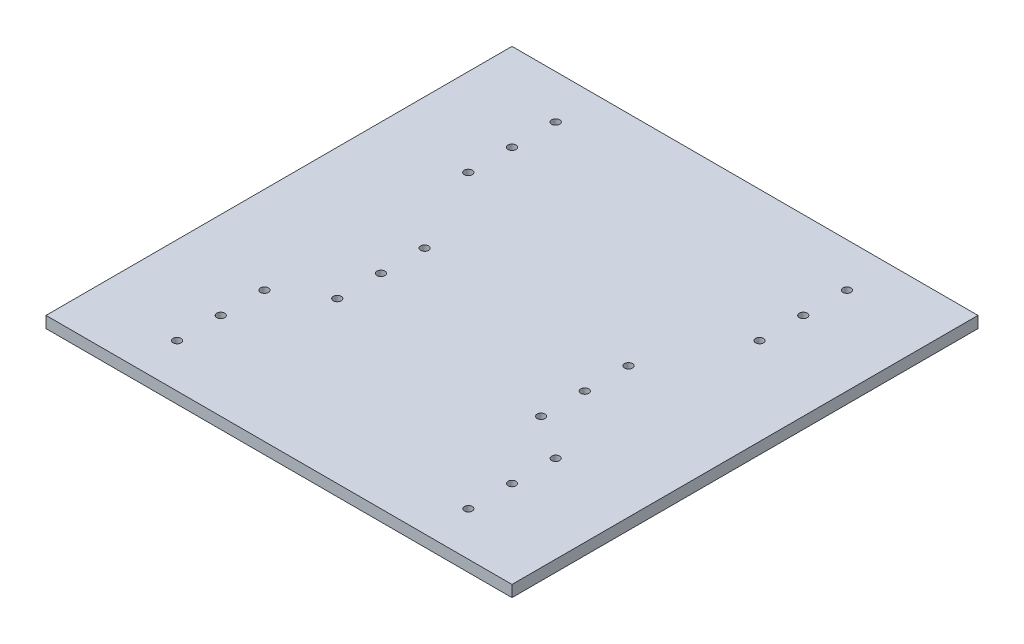
ISO-10303-21;
HEADER;
FILE_DESCRIPTION(('STEP AP214'),'2;1');
FILE_NAME('part.step','',(''),(''),'','','');
FILE_SCHEMA(('AUTOMOTIVE_DESIGN { 1 0 10303 214 1 1 1 1 }'));
ENDSEC;
DATA;
#1=APPLICATION_CONTEXT('core data for automotive mechanical design processes');
#2=APPLICATION_PROTOCOL_DEFINITION('international standard','automotive_design',2000,#1);
#3=PRODUCT_CONTEXT('',#1,'mechanical');
#4=PRODUCT('Part','Part','',(#3));
#5=PRODUCT_RELATED_PRODUCT_CATEGORY('part','',(#4));
#6=PRODUCT_DEFINITION_FORMATION('','',#4);
#7=PRODUCT_DEFINITION_CONTEXT('part definition',#1,'design');
#8=PRODUCT_DEFINITION('design','',#6,#7);
#9=PRODUCT_DEFINITION_SHAPE('','',#8);
#10=(LENGTH_UNIT() NAMED_UNIT(*) SI_UNIT(.MILLI.,.METRE.));
#11=(NAMED_UNIT(*) PLANE_ANGLE_UNIT() SI_UNIT($,.RADIAN.));
#12=(NAMED_UNIT(*) SI_UNIT($,.STERADIAN.) SOLID_ANGLE_UNIT());
#13=UNCERTAINTY_MEASURE_WITH_UNIT(LENGTH_MEASURE(1.E-05),#10,'distance_accuracy_value','');
#14=(GEOMETRIC_REPRESENTATION_CONTEXT(3) GLOBAL_UNCERTAINTY_ASSIGNED_CONTEXT((#13)) GLOBAL_UNIT_ASSIGNED_CONTEXT((#10,
#11,#12)) REPRESENTATION_CONTEXT('',''));
#15=CARTESIAN_POINT('',(0.,0.,0.));
#16=DIRECTION('',(0.,0.,1.));
#17=DIRECTION('',(1.,0.,0.));
#18=AXIS2_PLACEMENT_3D('',#15,#16,#17);
#19=CARTESIAN_POINT('',(0.,4.99999,0.));
#20=DIRECTION('',(0.,-1.,0.));
#21=DIRECTION('',(0.,0.,-1.));
#22=AXIS2_PLACEMENT_3D('',#19,#20,#21);
#23=PLANE('',#22);
#24=CARTESIAN_POINT('',(-44.45,4.99999,12.7));
#25=DIRECTION('',(0.,1.,0.));
#26=DIRECTION('',(0.,0.,1.));
#27=AXIS2_PLACEMENT_3D('',#24,#25,#26);
#28=CIRCLE('',#27,1.72719999999998);
#29=CARTESIAN_POINT('',(-44.45,4.99999,14.4272));
#30=VERTEX_POINT('',#29);
#31=EDGE_CURVE('E212',#30,#30,#28,.T.);
#32=ORIENTED_EDGE('',*,*,#31,.F.);
#33=EDGE_LOOP('',(#32));
#34=FACE_BOUND('',#33,.T.);
#35=CARTESIAN_POINT('',(44.45,4.99999,31.75));
#36=DIRECTION('',(0.,1.,0.));
#37=DIRECTION('',(0.,0.,1.));
#38=AXIS2_PLACEMENT_3D('',#35,#36,#37);
#39=CIRCLE('',#38,1.72719999999999);
#40=CARTESIAN_POINT('',(44.45,4.99999,33.4771999999999));
#41=VERTEX_POINT('',#40);
#42=EDGE_CURVE('E200',#41,#41,#39,.T.);
#43=ORIENTED_EDGE('',*,*,#42,.F.);
#44=EDGE_LOOP('',(#43));
#45=FACE_BOUND('',#44,.T.);
#46=CARTESIAN_POINT('',(44.45,4.99999,-6.35000000000004));
#47=DIRECTION('',(0.,1.,0.));
#48=DIRECTION('',(0.,0.,1.));
#49=AXIS2_PLACEMENT_3D('',#46,#47,#48);
#50=CIRCLE('',#49,1.72719999999999);
#51=CARTESIAN_POINT('',(44.45,4.99999,-4.62280000000005));
#52=VERTEX_POINT('',#51);
#53=EDGE_CURVE('E188',#52,#52,#50,.T.);
#54=ORIENTED_EDGE('',*,*,#53,.F.);
#55=EDGE_LOOP('',(#54));
#56=FACE_BOUND('',#55,.T.);
#57=CARTESIAN_POINT('',(-63.5,4.99999,63.5));
#58=DIRECTION('',(0.,1.,0.));
#59=DIRECTION('',(0.,0.,1.));
#60=AXIS2_PLACEMENT_3D('',#57,#58,#59);
#61=CIRCLE('',#60,1.72719999999998);
#62=CARTESIAN_POINT('',(-63.5,4.99999,65.2272));
#63=VERTEX_POINT('',#62);
#64=EDGE_CURVE('E176',#63,#63,#61,.T.);
#65=ORIENTED_EDGE('',*,*,#64,.F.);
#66=EDGE_LOOP('',(#65));
#67=FACE_BOUND('',#66,.T.);
#68=CARTESIAN_POINT('',(63.4999999999999,4.99999,44.45));
#69=DIRECTION('',(0.,1.,0.));
#70=DIRECTION('',(0.,0.,1.));
#71=AXIS2_PLACEMENT_3D('',#68,#69,#70);
#72=CIRCLE('',#71,1.72719999999998);
#73=CARTESIAN_POINT('',(63.4999999999999,4.99999,46.1772));
#74=VERTEX_POINT('',#73);
#75=EDGE_CURVE('E164',#74,#74,#72,.T.);
#76=ORIENTED_EDGE('',*,*,#75,.F.);
#77=EDGE_LOOP('',(#76));
#78=FACE_BOUND('',#77,.T.);
#79=CARTESIAN_POINT('',(63.4999999999999,4.99999,82.55));
#80=DIRECTION('',(0.,1.,0.));
#81=DIRECTION('',(0.,0.,1.));
#82=AXIS2_PLACEMENT_3D('',#79,#80,#81);
#83=CIRCLE('',#82,1.72719999999998);
#84=CARTESIAN_POINT('',(63.4999999999999,4.99999,84.2772));
#85=VERTEX_POINT('',#84);
#86=EDGE_CURVE('E158',#85,#85,#83,.T.);
#87=ORIENTED_EDGE('',*,*,#86,.F.);
#88=EDGE_LOOP('',(#87));
#89=FACE_BOUND('',#88,.T.);
#90=DIRECTION('',(0.,0.,-1.));
#91=VECTOR('',#90,1.);
#92=CARTESIAN_POINT('',(101.6,4.99999,101.6));
#93=LINE('',#92,#91);
#94=CARTESIAN_POINT('',(101.6,4.99999,101.6));
#95=VERTEX_POINT('',#94);
#96=CARTESIAN_POINT('',(101.6,4.99999,-101.6));
#97=VERTEX_POINT('',#96);
#98=EDGE_CURVE('E88',#95,#97,#93,.T.);
#99=ORIENTED_EDGE('',*,*,#98,.T.);
#100=DIRECTION('',(-1.,0.,0.));
#101=VECTOR('',#100,1.);
#102=CARTESIAN_POINT('',(-101.6,4.99999,-101.6));
#103=LINE('',#102,#101);
#104=CARTESIAN_POINT('',(-101.6,4.99999,-101.6));
#105=VERTEX_POINT('',#104);
#106=EDGE_CURVE('E83',#97,#105,#103,.T.);
#107=ORIENTED_EDGE('',*,*,#106,.T.);
#108=DIRECTION('',(0.,0.,1.));
#109=VECTOR('',#108,1.);
#110=CARTESIAN_POINT('',(-101.6,4.99999,101.6));
#111=LINE('',#110,#109);
#112=CARTESIAN_POINT('',(-101.6,4.99999,101.6));
#113=VERTEX_POINT('',#112);
#114=EDGE_CURVE('E86',#105,#113,#111,.T.);
#115=ORIENTED_EDGE('',*,*,#114,.T.);
#116=DIRECTION('',(1.,0.,0.));
#117=VECTOR('',#116,1.);
#118=CARTESIAN_POINT('',(-101.6,4.99999,101.6));
#119=LINE('',#118,#117);
#120=EDGE_CURVE('E53',#113,#95,#119,.T.);
#121=ORIENTED_EDGE('',*,*,#120,.T.);
#122=EDGE_LOOP('',(#99,#107,#115,#121));
#123=FACE_BOUND('',#122,.T.);
#124=CARTESIAN_POINT('',(-63.5,4.99999,-82.55));
#125=DIRECTION('',(0.,1.,0.));
#126=DIRECTION('',(0.,0.,1.));
#127=AXIS2_PLACEMENT_3D('',#124,#125,#126);
#128=CIRCLE('',#127,1.72719999999998);
#129=CARTESIAN_POINT('',(-63.5,4.99999,-80.8228));
#130=VERTEX_POINT('',#129);
#131=EDGE_CURVE('E116',#130,#130,#128,.T.);
#132=ORIENTED_EDGE('',*,*,#131,.F.);
#133=EDGE_LOOP('',(#132));
#134=FACE_BOUND('',#133,.T.);
#135=CARTESIAN_POINT('',(-63.5,4.99999,-63.5));
#136=DIRECTION('',(0.,1.,0.));
#137=DIRECTION('',(0.,0.,1.));
#138=AXIS2_PLACEMENT_3D('',#135,#136,#137);
#139=CIRCLE('',#138,1.72719999999998);
#140=CARTESIAN_POINT('',(-63.5,4.99999,-61.7728));
#141=VERTEX_POINT('',#140);
#142=EDGE_CURVE('E122',#141,#141,#139,.T.);
#143=ORIENTED_EDGE('',*,*,#142,.F.);
#144=EDGE_LOOP('',(#143));
#145=FACE_BOUND('',#144,.T.);
#146=CARTESIAN_POINT('',(-63.5,4.99999,-44.45));
#147=DIRECTION('',(0.,1.,0.));
#148=DIRECTION('',(0.,0.,1.));
#149=AXIS2_PLACEMENT_3D('',#146,#147,#148);
#150=CIRCLE('',#149,1.72719999999998);
#151=CARTESIAN_POINT('',(-63.5,4.99999,-42.7228));
#152=VERTEX_POINT('',#151);
#153=EDGE_CURVE('E128',#152,#152,#150,.T.);
#154=ORIENTED_EDGE('',*,*,#153,.F.);
#155=EDGE_LOOP('',(#154));
#156=FACE_BOUND('',#155,.T.);
#157=CARTESIAN_POINT('',(63.5,4.99999,-44.45));
#158=DIRECTION('',(0.,1.,0.));
#159=DIRECTION('',(0.,0.,1.));
#160=AXIS2_PLACEMENT_3D('',#157,#158,#159);
#161=CIRCLE('',#160,1.72719999999998);
#162=CARTESIAN_POINT('',(63.5,4.99999,-42.7228));
#163=VERTEX_POINT('',#162);
#164=EDGE_CURVE('E134',#163,#163,#161,.T.);
#165=ORIENTED_EDGE('',*,*,#164,.F.);
#166=EDGE_LOOP('',(#165));
#167=FACE_BOUND('',#166,.T.);
#168=CARTESIAN_POINT('',(63.5,4.99999,-63.5));
#169=DIRECTION('',(0.,1.,0.));
#170=DIRECTION('',(0.,0.,1.));
#171=AXIS2_PLACEMENT_3D('',#168,#169,#170);
#172=CIRCLE('',#171,1.72719999999998);
#173=CARTESIAN_POINT('',(63.5,4.99999,-61.7728));
#174=VERTEX_POINT('',#173);
#175=EDGE_CURVE('E140',#174,#174,#172,.T.);
#176=ORIENTED_EDGE('',*,*,#175,.F.);
#177=EDGE_LOOP('',(#176));
#178=FACE_BOUND('',#177,.T.);
#179=CARTESIAN_POINT('',(63.5,4.99999,-82.55));
#180=DIRECTION('',(0.,1.,0.));
#181=DIRECTION('',(0.,0.,1.));
#182=AXIS2_PLACEMENT_3D('',#179,#180,#181);
#183=CIRCLE('',#182,1.72719999999998);
#184=CARTESIAN_POINT('',(63.5,4.99999,-80.8228));
#185=VERTEX_POINT('',#184);
#186=EDGE_CURVE('E146',#185,#185,#183,.T.);
#187=ORIENTED_EDGE('',*,*,#186,.F.);
#188=EDGE_LOOP('',(#187));
#189=FACE_BOUND('',#188,.T.);
#190=CARTESIAN_POINT('',(63.4999999999999,4.99999,63.5));
#191=DIRECTION('',(0.,1.,0.));
#192=DIRECTION('',(0.,0.,1.));
#193=AXIS2_PLACEMENT_3D('',#190,#191,#192);
#194=CIRCLE('',#193,1.72719999999998);
#195=CARTESIAN_POINT('',(63.4999999999999,4.99999,65.2272));
#196=VERTEX_POINT('',#195);
#197=EDGE_CURVE('E152',#196,#196,#194,.T.);
#198=ORIENTED_EDGE('',*,*,#197,.F.);
#199=EDGE_LOOP('',(#198));
#200=FACE_BOUND('',#199,.T.);
#201=CARTESIAN_POINT('',(-63.5,4.99999,82.55));
#202=DIRECTION('',(0.,1.,0.));
#203=DIRECTION('',(0.,0.,1.));
#204=AXIS2_PLACEMENT_3D('',#201,#202,#203);
#205=CIRCLE('',#204,1.72719999999998);
#206=CARTESIAN_POINT('',(-63.5,4.99999,84.2772));
#207=VERTEX_POINT('',#206);
#208=EDGE_CURVE('E170',#207,#207,#205,.T.);
#209=ORIENTED_EDGE('',*,*,#208,.F.);
#210=EDGE_LOOP('',(#209));
#211=FACE_BOUND('',#210,.T.);
#212=CARTESIAN_POINT('',(-63.5,4.99999,44.45));
#213=DIRECTION('',(0.,1.,0.));
#214=DIRECTION('',(0.,0.,1.));
#215=AXIS2_PLACEMENT_3D('',#212,#213,#214);
#216=CIRCLE('',#215,1.72719999999998);
#217=CARTESIAN_POINT('',(-63.5,4.99999,46.1772));
#218=VERTEX_POINT('',#217);
#219=EDGE_CURVE('E182',#218,#218,#216,.T.);
#220=ORIENTED_EDGE('',*,*,#219,.F.);
#221=EDGE_LOOP('',(#220));
#222=FACE_BOUND('',#221,.T.);
#223=CARTESIAN_POINT('',(44.45,4.99999,12.7));
#224=DIRECTION('',(0.,1.,0.));
#225=DIRECTION('',(0.,0.,1.));
#226=AXIS2_PLACEMENT_3D('',#223,#224,#225);
#227=CIRCLE('',#226,1.72719999999999);
#228=CARTESIAN_POINT('',(44.45,4.99999,14.4271999999999));
#229=VERTEX_POINT('',#228);
#230=EDGE_CURVE('E194',#229,#229,#227,.T.);
#231=ORIENTED_EDGE('',*,*,#230,.F.);
#232=EDGE_LOOP('',(#231));
#233=FACE_BOUND('',#232,.T.);
#234=CARTESIAN_POINT('',(-44.45,4.99999,31.75));
#235=DIRECTION('',(0.,1.,0.));
#236=DIRECTION('',(0.,0.,1.));
#237=AXIS2_PLACEMENT_3D('',#234,#235,#236);
#238=CIRCLE('',#237,1.72719999999998);
#239=CARTESIAN_POINT('',(-44.45,4.99999,33.4771999999999));
#240=VERTEX_POINT('',#239);
#241=EDGE_CURVE('E206',#240,#240,#238,.T.);
#242=ORIENTED_EDGE('',*,*,#241,.F.);
#243=EDGE_LOOP('',(#242));
#244=FACE_BOUND('',#243,.T.);
#245=CARTESIAN_POINT('',(-44.45,4.99999,-6.35000000000004));
#246=DIRECTION('',(0.,1.,0.));
#247=DIRECTION('',(0.,0.,1.));
#248=AXIS2_PLACEMENT_3D('',#245,#246,#247);
#249=CIRCLE('',#248,1.72719999999998);
#250=CARTESIAN_POINT('',(-44.45,4.99999,-4.62280000000005));
#251=VERTEX_POINT('',#250);
#252=EDGE_CURVE('E218',#251,#251,#249,.T.);
#253=ORIENTED_EDGE('',*,*,#252,.F.);
#254=EDGE_LOOP('',(#253));
#255=FACE_BOUND('',#254,.T.);
#256=ADVANCED_FACE('F36',(#34,#45,#56,#67,#78,#89,#123,#134,#145,#156,#167,#178,#189,#200,#211,
#222,#233,#244,#255),#23,.F.);
#257=CARTESIAN_POINT('',(101.6,4.99999,101.6));
#258=DIRECTION('',(-1.,0.,0.));
#259=DIRECTION('',(0.,0.,1.));
#260=AXIS2_PLACEMENT_3D('',#257,#258,#259);
#261=PLANE('',#260);
#262=DIRECTION('',(0.,0.,-1.));
#263=VECTOR('',#262,1.);
#264=CARTESIAN_POINT('',(101.6,0.,101.6));
#265=LINE('',#264,#263);
#266=CARTESIAN_POINT('',(101.6,0.,101.6));
#267=VERTEX_POINT('',#266);
#268=CARTESIAN_POINT('',(101.6,0.,-101.6));
#269=VERTEX_POINT('',#268);
#270=EDGE_CURVE('E100',#267,#269,#265,.T.);
#271=ORIENTED_EDGE('',*,*,#270,.T.);
#272=DIRECTION('',(0.,-1.,0.));
#273=VECTOR('',#272,1.);
#274=CARTESIAN_POINT('',(101.6,4.99999,-101.6));
#275=LINE('',#274,#273);
#276=EDGE_CURVE('E11',#97,#269,#275,.T.);
#277=ORIENTED_EDGE('',*,*,#276,.F.);
#278=ORIENTED_EDGE('',*,*,#98,.F.);
#279=DIRECTION('',(0.,-1.,0.));
#280=VECTOR('',#279,1.);
#281=CARTESIAN_POINT('',(101.6,4.99999,101.6));
#282=LINE('',#281,#280);
#283=EDGE_CURVE('E96',#95,#267,#282,.T.);
#284=ORIENTED_EDGE('',*,*,#283,.T.);
#285=EDGE_LOOP('',(#271,#277,#278,#284));
#286=FACE_BOUND('',#285,.T.);
#287=ADVANCED_FACE('F38',(#286),#261,.F.);
#288=CARTESIAN_POINT('',(-101.6,4.99999,-101.6));
#289=DIRECTION('',(0.,0.,1.));
#290=DIRECTION('',(1.,0.,0.));
#291=AXIS2_PLACEMENT_3D('',#288,#289,#290);
#292=PLANE('',#291);
#293=DIRECTION('',(-1.,0.,0.));
#294=VECTOR('',#293,1.);
#295=CARTESIAN_POINT('',(-101.6,0.,-101.6));
#296=LINE('',#295,#294);
#297=CARTESIAN_POINT('',(-101.6,0.,-101.6));
#298=VERTEX_POINT('',#297);
#299=EDGE_CURVE('E92',#269,#298,#296,.T.);
#300=ORIENTED_EDGE('',*,*,#299,.T.);
#301=DIRECTION('',(0.,-1.,0.));
#302=VECTOR('',#301,1.);
#303=CARTESIAN_POINT('',(-101.6,4.99999,-101.6));
#304=LINE('',#303,#302);
#305=EDGE_CURVE('E45',#105,#298,#304,.T.);
#306=ORIENTED_EDGE('',*,*,#305,.F.);
#307=ORIENTED_EDGE('',*,*,#106,.F.);
#308=ORIENTED_EDGE('',*,*,#276,.T.);
#309=EDGE_LOOP('',(#300,#306,#307,#308));
#310=FACE_BOUND('',#309,.T.);
#311=ADVANCED_FACE('F91',(#310),#292,.F.);
#312=CARTESIAN_POINT('',(-101.6,4.99999,101.6));
#313=DIRECTION('',(1.,0.,0.));
#314=DIRECTION('',(0.,0.,-1.));
#315=AXIS2_PLACEMENT_3D('',#312,#313,#314);
#316=PLANE('',#315);
#317=DIRECTION('',(0.,0.,1.));
#318=VECTOR('',#317,1.);
#319=CARTESIAN_POINT('',(-101.6,0.,101.6));
#320=LINE('',#319,#318);
#321=CARTESIAN_POINT('',(-101.6,0.,101.6));
#322=VERTEX_POINT('',#321);
#323=EDGE_CURVE('E70',#298,#322,#320,.T.);
#324=ORIENTED_EDGE('',*,*,#323,.T.);
#325=DIRECTION('',(0.,-1.,0.));
#326=VECTOR('',#325,1.);
#327=CARTESIAN_POINT('',(-101.6,4.99999,101.6));
#328=LINE('',#327,#326);
#329=EDGE_CURVE('E93',#113,#322,#328,.T.);
#330=ORIENTED_EDGE('',*,*,#329,.F.);
#331=ORIENTED_EDGE('',*,*,#114,.F.);
#332=ORIENTED_EDGE('',*,*,#305,.T.);
#333=EDGE_LOOP('',(#324,#330,#331,#332));
#334=FACE_BOUND('',#333,.T.);
#335=ADVANCED_FACE('F94',(#334),#316,.F.);
#336=CARTESIAN_POINT('',(-101.6,4.99999,101.6));
#337=DIRECTION('',(0.,0.,-1.));
#338=DIRECTION('',(-1.,0.,0.));
#339=AXIS2_PLACEMENT_3D('',#336,#337,#338);
#340=PLANE('',#339);
#341=DIRECTION('',(1.,0.,0.));
#342=VECTOR('',#341,1.);
#343=CARTESIAN_POINT('',(-101.6,0.,101.6));
#344=LINE('',#343,#342);
#345=EDGE_CURVE('E76',#322,#267,#344,.T.);
#346=ORIENTED_EDGE('',*,*,#345,.T.);
#347=ORIENTED_EDGE('',*,*,#283,.F.);
#348=ORIENTED_EDGE('',*,*,#120,.F.);
#349=ORIENTED_EDGE('',*,*,#329,.T.);
#350=EDGE_LOOP('',(#346,#347,#348,#349));
#351=FACE_BOUND('',#350,.T.);
#352=ADVANCED_FACE('F108',(#351),#340,.F.);
#353=CARTESIAN_POINT('',(0.,0.,0.));
#354=DIRECTION('',(0.,-1.,0.));
#355=DIRECTION('',(0.,0.,-1.));
#356=AXIS2_PLACEMENT_3D('',#353,#354,#355);
#357=PLANE('',#356);
#358=CARTESIAN_POINT('',(-44.45,0.,-6.35000000000004));
#359=DIRECTION('',(0.,-1.,0.));
#360=DIRECTION('',(0.,0.,-1.));
#361=AXIS2_PLACEMENT_3D('',#358,#359,#360);
#362=CIRCLE('',#361,1.72719999999999);
#363=CARTESIAN_POINT('',(-44.45,0.,-8.07720000000003));
#364=VERTEX_POINT('',#363);
#365=EDGE_CURVE('E215',#364,#364,#362,.T.);
#366=ORIENTED_EDGE('',*,*,#365,.F.);
#367=EDGE_LOOP('',(#366));
#368=FACE_BOUND('',#367,.T.);
#369=CARTESIAN_POINT('',(-44.45,0.,12.7));
#370=DIRECTION('',(0.,-1.,0.));
#371=DIRECTION('',(0.,0.,-1.));
#372=AXIS2_PLACEMENT_3D('',#369,#370,#371);
#373=CIRCLE('',#372,1.72719999999999);
#374=CARTESIAN_POINT('',(-44.45,0.,10.9728));
#375=VERTEX_POINT('',#374);
#376=EDGE_CURVE('E209',#375,#375,#373,.T.);
#377=ORIENTED_EDGE('',*,*,#376,.F.);
#378=EDGE_LOOP('',(#377));
#379=FACE_BOUND('',#378,.T.);
#380=CARTESIAN_POINT('',(-44.45,0.,31.75));
#381=DIRECTION('',(0.,-1.,0.));
#382=DIRECTION('',(0.,0.,-1.));
#383=AXIS2_PLACEMENT_3D('',#380,#381,#382);
#384=CIRCLE('',#383,1.72719999999999);
#385=CARTESIAN_POINT('',(-44.45,0.,30.0228));
#386=VERTEX_POINT('',#385);
#387=EDGE_CURVE('E203',#386,#386,#384,.T.);
#388=ORIENTED_EDGE('',*,*,#387,.F.);
#389=EDGE_LOOP('',(#388));
#390=FACE_BOUND('',#389,.T.);
#391=CARTESIAN_POINT('',(44.45,0.,31.75));
#392=DIRECTION('',(0.,-1.,0.));
#393=DIRECTION('',(0.,0.,-1.));
#394=AXIS2_PLACEMENT_3D('',#391,#392,#393);
#395=CIRCLE('',#394,1.72719999999999);
#396=CARTESIAN_POINT('',(44.45,0.,30.0228));
#397=VERTEX_POINT('',#396);
#398=EDGE_CURVE('E197',#397,#397,#395,.T.);
#399=ORIENTED_EDGE('',*,*,#398,.F.);
#400=EDGE_LOOP('',(#399));
#401=FACE_BOUND('',#400,.T.);
#402=CARTESIAN_POINT('',(44.45,0.,12.7));
#403=DIRECTION('',(0.,-1.,0.));
#404=DIRECTION('',(0.,0.,-1.));
#405=AXIS2_PLACEMENT_3D('',#402,#403,#404);
#406=CIRCLE('',#405,1.72719999999999);
#407=CARTESIAN_POINT('',(44.45,0.,10.9728));
#408=VERTEX_POINT('',#407);
#409=EDGE_CURVE('E191',#408,#408,#406,.T.);
#410=ORIENTED_EDGE('',*,*,#409,.F.);
#411=EDGE_LOOP('',(#410));
#412=FACE_BOUND('',#411,.T.);
#413=CARTESIAN_POINT('',(44.45,0.,-6.35000000000004));
#414=DIRECTION('',(0.,-1.,0.));
#415=DIRECTION('',(0.,0.,-1.));
#416=AXIS2_PLACEMENT_3D('',#413,#414,#415);
#417=CIRCLE('',#416,1.72719999999999);
#418=CARTESIAN_POINT('',(44.45,0.,-8.07720000000004));
#419=VERTEX_POINT('',#418);
#420=EDGE_CURVE('E185',#419,#419,#417,.T.);
#421=ORIENTED_EDGE('',*,*,#420,.F.);
#422=EDGE_LOOP('',(#421));
#423=FACE_BOUND('',#422,.T.);
#424=CARTESIAN_POINT('',(-63.5,0.,44.45));
#425=DIRECTION('',(0.,-1.,0.));
#426=DIRECTION('',(0.,0.,-1.));
#427=AXIS2_PLACEMENT_3D('',#424,#425,#426);
#428=CIRCLE('',#427,1.72719999999999);
#429=CARTESIAN_POINT('',(-63.5,0.,42.7228));
#430=VERTEX_POINT('',#429);
#431=EDGE_CURVE('E179',#430,#430,#428,.T.);
#432=ORIENTED_EDGE('',*,*,#431,.F.);
#433=EDGE_LOOP('',(#432));
#434=FACE_BOUND('',#433,.T.);
#435=CARTESIAN_POINT('',(-63.5,0.,63.5));
#436=DIRECTION('',(0.,-1.,0.));
#437=DIRECTION('',(0.,0.,-1.));
#438=AXIS2_PLACEMENT_3D('',#435,#436,#437);
#439=CIRCLE('',#438,1.72719999999999);
#440=CARTESIAN_POINT('',(-63.5,0.,61.7728));
#441=VERTEX_POINT('',#440);
#442=EDGE_CURVE('E173',#441,#441,#439,.T.);
#443=ORIENTED_EDGE('',*,*,#442,.F.);
#444=EDGE_LOOP('',(#443));
#445=FACE_BOUND('',#444,.T.);
#446=CARTESIAN_POINT('',(-63.5,0.,82.55));
#447=DIRECTION('',(0.,-1.,0.));
#448=DIRECTION('',(0.,0.,-1.));
#449=AXIS2_PLACEMENT_3D('',#446,#447,#448);
#450=CIRCLE('',#449,1.72719999999999);
#451=CARTESIAN_POINT('',(-63.5,0.,80.8228));
#452=VERTEX_POINT('',#451);
#453=EDGE_CURVE('E167',#452,#452,#450,.T.);
#454=ORIENTED_EDGE('',*,*,#453,.F.);
#455=EDGE_LOOP('',(#454));
#456=FACE_BOUND('',#455,.T.);
#457=CARTESIAN_POINT('',(63.4999999999999,0.,44.45));
#458=DIRECTION('',(0.,-1.,0.));
#459=DIRECTION('',(0.,0.,-1.));
#460=AXIS2_PLACEMENT_3D('',#457,#458,#459);
#461=CIRCLE('',#460,1.72719999999999);
#462=CARTESIAN_POINT('',(63.4999999999999,0.,42.7228));
#463=VERTEX_POINT('',#462);
#464=EDGE_CURVE('E161',#463,#463,#461,.T.);
#465=ORIENTED_EDGE('',*,*,#464,.F.);
#466=EDGE_LOOP('',(#465));
#467=FACE_BOUND('',#466,.T.);
#468=CARTESIAN_POINT('',(63.4999999999999,0.,82.55));
#469=DIRECTION('',(0.,-1.,0.));
#470=DIRECTION('',(0.,0.,-1.));
#471=AXIS2_PLACEMENT_3D('',#468,#469,#470);
#472=CIRCLE('',#471,1.72719999999999);
#473=CARTESIAN_POINT('',(63.4999999999999,0.,80.8228));
#474=VERTEX_POINT('',#473);
#475=EDGE_CURVE('E155',#474,#474,#472,.T.);
#476=ORIENTED_EDGE('',*,*,#475,.F.);
#477=EDGE_LOOP('',(#476));
#478=FACE_BOUND('',#477,.T.);
#479=CARTESIAN_POINT('',(63.4999999999999,0.,63.5));
#480=DIRECTION('',(0.,-1.,0.));
#481=DIRECTION('',(0.,0.,-1.));
#482=AXIS2_PLACEMENT_3D('',#479,#480,#481);
#483=CIRCLE('',#482,1.72719999999999);
#484=CARTESIAN_POINT('',(63.4999999999999,0.,61.7728));
#485=VERTEX_POINT('',#484);
#486=EDGE_CURVE('E149',#485,#485,#483,.T.);
#487=ORIENTED_EDGE('',*,*,#486,.F.);
#488=EDGE_LOOP('',(#487));
#489=FACE_BOUND('',#488,.T.);
#490=CARTESIAN_POINT('',(63.5,0.,-82.55));
#491=DIRECTION('',(0.,-1.,0.));
#492=DIRECTION('',(0.,0.,-1.));
#493=AXIS2_PLACEMENT_3D('',#490,#491,#492);
#494=CIRCLE('',#493,1.72719999999999);
#495=CARTESIAN_POINT('',(63.5,0.,-84.2772));
#496=VERTEX_POINT('',#495);
#497=EDGE_CURVE('E143',#496,#496,#494,.T.);
#498=ORIENTED_EDGE('',*,*,#497,.F.);
#499=EDGE_LOOP('',(#498));
#500=FACE_BOUND('',#499,.T.);
#501=CARTESIAN_POINT('',(63.5,0.,-63.5));
#502=DIRECTION('',(0.,-1.,0.));
#503=DIRECTION('',(0.,0.,-1.));
#504=AXIS2_PLACEMENT_3D('',#501,#502,#503);
#505=CIRCLE('',#504,1.72719999999999);
#506=CARTESIAN_POINT('',(63.5,0.,-65.2272));
#507=VERTEX_POINT('',#506);
#508=EDGE_CURVE('E137',#507,#507,#505,.T.);
#509=ORIENTED_EDGE('',*,*,#508,.F.);
#510=EDGE_LOOP('',(#509));
#511=FACE_BOUND('',#510,.T.);
#512=CARTESIAN_POINT('',(63.5,0.,-44.45));
#513=DIRECTION('',(0.,-1.,0.));
#514=DIRECTION('',(0.,0.,-1.));
#515=AXIS2_PLACEMENT_3D('',#512,#513,#514);
#516=CIRCLE('',#515,1.72719999999999);
#517=CARTESIAN_POINT('',(63.5,0.,-46.1772));
#518=VERTEX_POINT('',#517);
#519=EDGE_CURVE('E131',#518,#518,#516,.T.);
#520=ORIENTED_EDGE('',*,*,#519,.F.);
#521=EDGE_LOOP('',(#520));
#522=FACE_BOUND('',#521,.T.);
#523=CARTESIAN_POINT('',(-63.5,0.,-44.45));
#524=DIRECTION('',(0.,-1.,0.));
#525=DIRECTION('',(0.,0.,-1.));
#526=AXIS2_PLACEMENT_3D('',#523,#524,#525);
#527=CIRCLE('',#526,1.72719999999999);
#528=CARTESIAN_POINT('',(-63.5,0.,-46.1772));
#529=VERTEX_POINT('',#528);
#530=EDGE_CURVE('E125',#529,#529,#527,.T.);
#531=ORIENTED_EDGE('',*,*,#530,.F.);
#532=EDGE_LOOP('',(#531));
#533=FACE_BOUND('',#532,.T.);
#534=CARTESIAN_POINT('',(-63.5,0.,-63.5));
#535=DIRECTION('',(0.,-1.,0.));
#536=DIRECTION('',(0.,0.,-1.));
#537=AXIS2_PLACEMENT_3D('',#534,#535,#536);
#538=CIRCLE('',#537,1.72719999999999);
#539=CARTESIAN_POINT('',(-63.5,0.,-65.2272));
#540=VERTEX_POINT('',#539);
#541=EDGE_CURVE('E119',#540,#540,#538,.T.);
#542=ORIENTED_EDGE('',*,*,#541,.F.);
#543=EDGE_LOOP('',(#542));
#544=FACE_BOUND('',#543,.T.);
#545=CARTESIAN_POINT('',(-63.5,0.,-82.55));
#546=DIRECTION('',(0.,-1.,0.));
#547=DIRECTION('',(0.,0.,-1.));
#548=AXIS2_PLACEMENT_3D('',#545,#546,#547);
#549=CIRCLE('',#548,1.72719999999999);
#550=CARTESIAN_POINT('',(-63.5,0.,-84.2772));
#551=VERTEX_POINT('',#550);
#552=EDGE_CURVE('E103',#551,#551,#549,.T.);
#553=ORIENTED_EDGE('',*,*,#552,.F.);
#554=EDGE_LOOP('',(#553));
#555=FACE_BOUND('',#554,.T.);
#556=ORIENTED_EDGE('',*,*,#270,.F.);
#557=ORIENTED_EDGE('',*,*,#345,.F.);
#558=ORIENTED_EDGE('',*,*,#323,.F.);
#559=ORIENTED_EDGE('',*,*,#299,.F.);
#560=EDGE_LOOP('',(#556,#557,#558,#559));
#561=FACE_BOUND('',#560,.T.);
#562=ADVANCED_FACE('F111',(#368,#379,#390,#401,#412,#423,#434,#445,#456,#467,#478,#489,#500,
#511,#522,#533,#544,#555,#561),#357,.T.);
#563=CARTESIAN_POINT('',(-63.5,4.99999,-82.55));
#564=DIRECTION('',(0.,1.,0.));
#565=DIRECTION('',(0.,0.,1.));
#566=AXIS2_PLACEMENT_3D('',#563,#564,#565);
#567=CYLINDRICAL_SURFACE('',#566,1.72719999999999);
#568=ORIENTED_EDGE('',*,*,#131,.T.);
#569=EDGE_LOOP('',(#568));
#570=FACE_BOUND('',#569,.T.);
#571=ORIENTED_EDGE('',*,*,#552,.T.);
#572=EDGE_LOOP('',(#571));
#573=FACE_BOUND('',#572,.T.);
#574=ADVANCED_FACE('F235',(#570,#573),#567,.F.);
#575=CARTESIAN_POINT('',(-63.5,4.99999,-63.5));
#576=DIRECTION('',(0.,1.,0.));
#577=DIRECTION('',(0.,0.,1.));
#578=AXIS2_PLACEMENT_3D('',#575,#576,#577);
#579=CYLINDRICAL_SURFACE('',#578,1.72719999999999);
#580=ORIENTED_EDGE('',*,*,#142,.T.);
#581=EDGE_LOOP('',(#580));
#582=FACE_BOUND('',#581,.T.);
#583=ORIENTED_EDGE('',*,*,#541,.T.);
#584=EDGE_LOOP('',(#583));
#585=FACE_BOUND('',#584,.T.);
#586=ADVANCED_FACE('F267',(#582,#585),#579,.F.);
#587=CARTESIAN_POINT('',(-63.5,4.99999,-44.45));
#588=DIRECTION('',(0.,1.,0.));
#589=DIRECTION('',(0.,0.,1.));
#590=AXIS2_PLACEMENT_3D('',#587,#588,#589);
#591=CYLINDRICAL_SURFACE('',#590,1.72719999999999);
#592=ORIENTED_EDGE('',*,*,#153,.T.);
#593=EDGE_LOOP('',(#592));
#594=FACE_BOUND('',#593,.T.);
#595=ORIENTED_EDGE('',*,*,#530,.T.);
#596=EDGE_LOOP('',(#595));
#597=FACE_BOUND('',#596,.T.);
#598=ADVANCED_FACE('F274',(#594,#597),#591,.F.);
#599=CARTESIAN_POINT('',(63.5,4.99999,-44.45));
#600=DIRECTION('',(0.,1.,0.));
#601=DIRECTION('',(0.,0.,1.));
#602=AXIS2_PLACEMENT_3D('',#599,#600,#601);
#603=CYLINDRICAL_SURFACE('',#602,1.72719999999999);
#604=ORIENTED_EDGE('',*,*,#164,.T.);
#605=EDGE_LOOP('',(#604));
#606=FACE_BOUND('',#605,.T.);
#607=ORIENTED_EDGE('',*,*,#519,.T.);
#608=EDGE_LOOP('',(#607));
#609=FACE_BOUND('',#608,.T.);
#610=ADVANCED_FACE('F281',(#606,#609),#603,.F.);
#611=CARTESIAN_POINT('',(63.5,4.99999,-63.5));
#612=DIRECTION('',(0.,1.,0.));
#613=DIRECTION('',(0.,0.,1.));
#614=AXIS2_PLACEMENT_3D('',#611,#612,#613);
#615=CYLINDRICAL_SURFACE('',#614,1.72719999999999);
#616=ORIENTED_EDGE('',*,*,#175,.T.);
#617=EDGE_LOOP('',(#616));
#618=FACE_BOUND('',#617,.T.);
#619=ORIENTED_EDGE('',*,*,#508,.T.);
#620=EDGE_LOOP('',(#619));
#621=FACE_BOUND('',#620,.T.);
#622=ADVANCED_FACE('F289',(#618,#621),#615,.F.);
#623=CARTESIAN_POINT('',(63.5,4.99999,-82.55));
#624=DIRECTION('',(0.,1.,0.));
#625=DIRECTION('',(0.,0.,1.));
#626=AXIS2_PLACEMENT_3D('',#623,#624,#625);
#627=CYLINDRICAL_SURFACE('',#626,1.72719999999999);
#628=ORIENTED_EDGE('',*,*,#186,.T.);
#629=EDGE_LOOP('',(#628));
#630=FACE_BOUND('',#629,.T.);
#631=ORIENTED_EDGE('',*,*,#497,.T.);
#632=EDGE_LOOP('',(#631));
#633=FACE_BOUND('',#632,.T.);
#634=ADVANCED_FACE('F297',(#630,#633),#627,.F.);
#635=CARTESIAN_POINT('',(63.4999999999999,4.99999,63.5));
#636=DIRECTION('',(0.,1.,0.));
#637=DIRECTION('',(0.,0.,1.));
#638=AXIS2_PLACEMENT_3D('',#635,#636,#637);
#639=CYLINDRICAL_SURFACE('',#638,1.72719999999999);
#640=ORIENTED_EDGE('',*,*,#197,.T.);
#641=EDGE_LOOP('',(#640));
#642=FACE_BOUND('',#641,.T.);
#643=ORIENTED_EDGE('',*,*,#486,.T.);
#644=EDGE_LOOP('',(#643));
#645=FACE_BOUND('',#644,.T.);
#646=ADVANCED_FACE('F305',(#642,#645),#639,.F.);
#647=CARTESIAN_POINT('',(63.4999999999999,4.99999,82.55));
#648=DIRECTION('',(0.,1.,0.));
#649=DIRECTION('',(0.,0.,1.));
#650=AXIS2_PLACEMENT_3D('',#647,#648,#649);
#651=CYLINDRICAL_SURFACE('',#650,1.72719999999999);
#652=ORIENTED_EDGE('',*,*,#86,.T.);
#653=EDGE_LOOP('',(#652));
#654=FACE_BOUND('',#653,.T.);
#655=ORIENTED_EDGE('',*,*,#475,.T.);
#656=EDGE_LOOP('',(#655));
#657=FACE_BOUND('',#656,.T.);
#658=ADVANCED_FACE('F313',(#654,#657),#651,.F.);
#659=CARTESIAN_POINT('',(63.4999999999999,4.99999,44.45));
#660=DIRECTION('',(0.,1.,0.));
#661=DIRECTION('',(0.,0.,1.));
#662=AXIS2_PLACEMENT_3D('',#659,#660,#661);
#663=CYLINDRICAL_SURFACE('',#662,1.72719999999999);
#664=ORIENTED_EDGE('',*,*,#75,.T.);
#665=EDGE_LOOP('',(#664));
#666=FACE_BOUND('',#665,.T.);
#667=ORIENTED_EDGE('',*,*,#464,.T.);
#668=EDGE_LOOP('',(#667));
#669=FACE_BOUND('',#668,.T.);
#670=ADVANCED_FACE('F321',(#666,#669),#663,.F.);
#671=CARTESIAN_POINT('',(-63.5,4.99999,82.55));
#672=DIRECTION('',(0.,1.,0.));
#673=DIRECTION('',(0.,0.,1.));
#674=AXIS2_PLACEMENT_3D('',#671,#672,#673);
#675=CYLINDRICAL_SURFACE('',#674,1.72719999999999);
#676=ORIENTED_EDGE('',*,*,#208,.T.);
#677=EDGE_LOOP('',(#676));
#678=FACE_BOUND('',#677,.T.);
#679=ORIENTED_EDGE('',*,*,#453,.T.);
#680=EDGE_LOOP('',(#679));
#681=FACE_BOUND('',#680,.T.);
#682=ADVANCED_FACE('F329',(#678,#681),#675,.F.);
#683=CARTESIAN_POINT('',(-63.5,4.99999,63.5));
#684=DIRECTION('',(0.,1.,0.));
#685=DIRECTION('',(0.,0.,1.));
#686=AXIS2_PLACEMENT_3D('',#683,#684,#685);
#687=CYLINDRICAL_SURFACE('',#686,1.72719999999999);
#688=ORIENTED_EDGE('',*,*,#64,.T.);
#689=EDGE_LOOP('',(#688));
#690=FACE_BOUND('',#689,.T.);
#691=ORIENTED_EDGE('',*,*,#442,.T.);
#692=EDGE_LOOP('',(#691));
#693=FACE_BOUND('',#692,.T.);
#694=ADVANCED_FACE('F337',(#690,#693),#687,.F.);
#695=CARTESIAN_POINT('',(-63.5,4.99999,44.45));
#696=DIRECTION('',(0.,1.,0.));
#697=DIRECTION('',(0.,0.,1.));
#698=AXIS2_PLACEMENT_3D('',#695,#696,#697);
#699=CYLINDRICAL_SURFACE('',#698,1.72719999999999);
#700=ORIENTED_EDGE('',*,*,#219,.T.);
#701=EDGE_LOOP('',(#700));
#702=FACE_BOUND('',#701,.T.);
#703=ORIENTED_EDGE('',*,*,#431,.T.);
#704=EDGE_LOOP('',(#703));
#705=FACE_BOUND('',#704,.T.);
#706=ADVANCED_FACE('F345',(#702,#705),#699,.F.);
#707=CARTESIAN_POINT('',(44.45,4.99999,-6.35000000000004));
#708=DIRECTION('',(0.,1.,0.));
#709=DIRECTION('',(0.,0.,1.));
#710=AXIS2_PLACEMENT_3D('',#707,#708,#709);
#711=CYLINDRICAL_SURFACE('',#710,1.72719999999999);
#712=ORIENTED_EDGE('',*,*,#53,.T.);
#713=EDGE_LOOP('',(#712));
#714=FACE_BOUND('',#713,.T.);
#715=ORIENTED_EDGE('',*,*,#420,.T.);
#716=EDGE_LOOP('',(#715));
#717=FACE_BOUND('',#716,.T.);
#718=ADVANCED_FACE('F353',(#714,#717),#711,.F.);
#719=CARTESIAN_POINT('',(44.45,4.99999,12.7));
#720=DIRECTION('',(0.,1.,0.));
#721=DIRECTION('',(0.,0.,1.));
#722=AXIS2_PLACEMENT_3D('',#719,#720,#721);
#723=CYLINDRICAL_SURFACE('',#722,1.72719999999999);
#724=ORIENTED_EDGE('',*,*,#230,.T.);
#725=EDGE_LOOP('',(#724));
#726=FACE_BOUND('',#725,.T.);
#727=ORIENTED_EDGE('',*,*,#409,.T.);
#728=EDGE_LOOP('',(#727));
#729=FACE_BOUND('',#728,.T.);
#730=ADVANCED_FACE('F361',(#726,#729),#723,.F.);
#731=CARTESIAN_POINT('',(44.45,4.99999,31.75));
#732=DIRECTION('',(0.,1.,0.));
#733=DIRECTION('',(0.,0.,1.));
#734=AXIS2_PLACEMENT_3D('',#731,#732,#733);
#735=CYLINDRICAL_SURFACE('',#734,1.72719999999999);
#736=ORIENTED_EDGE('',*,*,#42,.T.);
#737=EDGE_LOOP('',(#736));
#738=FACE_BOUND('',#737,.T.);
#739=ORIENTED_EDGE('',*,*,#398,.T.);
#740=EDGE_LOOP('',(#739));
#741=FACE_BOUND('',#740,.T.);
#742=ADVANCED_FACE('F369',(#738,#741),#735,.F.);
#743=CARTESIAN_POINT('',(-44.45,4.99999,31.75));
#744=DIRECTION('',(0.,1.,0.));
#745=DIRECTION('',(0.,0.,1.));
#746=AXIS2_PLACEMENT_3D('',#743,#744,#745);
#747=CYLINDRICAL_SURFACE('',#746,1.72719999999999);
#748=ORIENTED_EDGE('',*,*,#241,.T.);
#749=EDGE_LOOP('',(#748));
#750=FACE_BOUND('',#749,.T.);
#751=ORIENTED_EDGE('',*,*,#387,.T.);
#752=EDGE_LOOP('',(#751));
#753=FACE_BOUND('',#752,.T.);
#754=ADVANCED_FACE('F377',(#750,#753),#747,.F.);
#755=CARTESIAN_POINT('',(-44.45,4.99999,12.7));
#756=DIRECTION('',(0.,1.,0.));
#757=DIRECTION('',(0.,0.,1.));
#758=AXIS2_PLACEMENT_3D('',#755,#756,#757);
#759=CYLINDRICAL_SURFACE('',#758,1.72719999999999);
#760=ORIENTED_EDGE('',*,*,#31,.T.);
#761=EDGE_LOOP('',(#760));
#762=FACE_BOUND('',#761,.T.);
#763=ORIENTED_EDGE('',*,*,#376,.T.);
#764=EDGE_LOOP('',(#763));
#765=FACE_BOUND('',#764,.T.);
#766=ADVANCED_FACE('F385',(#762,#765),#759,.F.);
#767=CARTESIAN_POINT('',(-44.45,4.99999,-6.35000000000004));
#768=DIRECTION('',(0.,1.,0.));
#769=DIRECTION('',(0.,0.,1.));
#770=AXIS2_PLACEMENT_3D('',#767,#768,#769);
#771=CYLINDRICAL_SURFACE('',#770,1.72719999999999);
#772=ORIENTED_EDGE('',*,*,#252,.T.);
#773=EDGE_LOOP('',(#772));
#774=FACE_BOUND('',#773,.T.);
#775=ORIENTED_EDGE('',*,*,#365,.T.);
#776=EDGE_LOOP('',(#775));
#777=FACE_BOUND('',#776,.T.);
#778=ADVANCED_FACE('F222',(#774,#777),#771,.F.);
#779=CLOSED_SHELL('',(#256,#287,#311,#335,#352,#562,#574,#586,#598,#610,#622,#634,#646,#658,
#670,#682,#694,#706,#718,#730,#742,#754,#766,#778));
#780=MANIFOLD_SOLID_BREP('B2',#779);
#781=ADVANCED_BREP_SHAPE_REPRESENTATION('',(#18,#780),#14);
#782=SHAPE_DEFINITION_REPRESENTATION(#9,#781);
ENDSEC;
END-ISO-10303-21;
